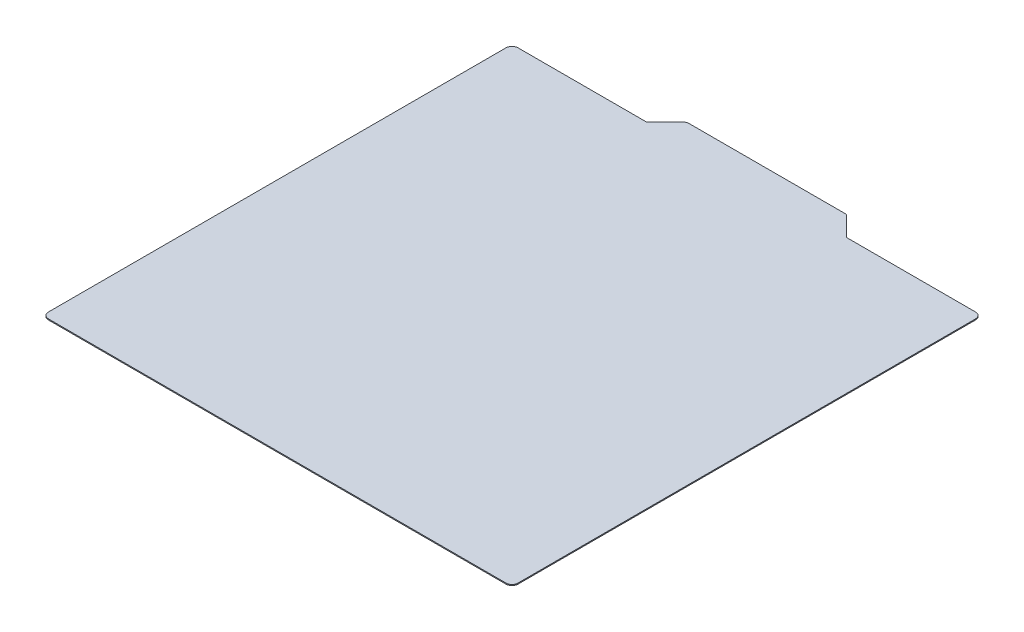
ISO-10303-21;
HEADER;
FILE_DESCRIPTION(('STEP AP214'),'2;1');
FILE_NAME('part.step','',(''),(''),'','','');
FILE_SCHEMA(('AUTOMOTIVE_DESIGN { 1 0 10303 214 1 1 1 1 }'));
ENDSEC;
DATA;
#1=APPLICATION_CONTEXT('core data for automotive mechanical design processes');
#2=APPLICATION_PROTOCOL_DEFINITION('international standard','automotive_design',2000,#1);
#3=PRODUCT_CONTEXT('',#1,'mechanical');
#4=PRODUCT('Part','Part','',(#3));
#5=PRODUCT_RELATED_PRODUCT_CATEGORY('part','',(#4));
#6=PRODUCT_DEFINITION_FORMATION('','',#4);
#7=PRODUCT_DEFINITION_CONTEXT('part definition',#1,'design');
#8=PRODUCT_DEFINITION('design','',#6,#7);
#9=PRODUCT_DEFINITION_SHAPE('','',#8);
#10=(LENGTH_UNIT() NAMED_UNIT(*) SI_UNIT(.MILLI.,.METRE.));
#11=(NAMED_UNIT(*) PLANE_ANGLE_UNIT() SI_UNIT($,.RADIAN.));
#12=(NAMED_UNIT(*) SI_UNIT($,.STERADIAN.) SOLID_ANGLE_UNIT());
#13=UNCERTAINTY_MEASURE_WITH_UNIT(LENGTH_MEASURE(1.E-05),#10,'distance_accuracy_value','');
#14=(GEOMETRIC_REPRESENTATION_CONTEXT(3) GLOBAL_UNCERTAINTY_ASSIGNED_CONTEXT((#13)) GLOBAL_UNIT_ASSIGNED_CONTEXT((#10,
#11,#12)) REPRESENTATION_CONTEXT('',''));
#15=CARTESIAN_POINT('',(0.,0.,0.));
#16=DIRECTION('',(0.,0.,1.));
#17=DIRECTION('',(1.,0.,0.));
#18=AXIS2_PLACEMENT_3D('',#15,#16,#17);
#19=CARTESIAN_POINT('',(-114.5,0.5,-117.5));
#20=DIRECTION('',(0.,0.,1.));
#21=DIRECTION('',(1.,0.,0.));
#22=AXIS2_PLACEMENT_3D('',#19,#20,#21);
#23=PLANE('',#22);
#24=DIRECTION('',(-1.,0.,0.));
#25=VECTOR('',#24,1.);
#26=CARTESIAN_POINT('',(-114.5,0.,-117.5));
#27=LINE('',#26,#25);
#28=CARTESIAN_POINT('',(114.5,0.,-117.5));
#29=VERTEX_POINT('',#28);
#30=CARTESIAN_POINT('',(50.,0.,-117.5));
#31=VERTEX_POINT('',#30);
#32=EDGE_CURVE('E131',#29,#31,#27,.T.);
#33=ORIENTED_EDGE('',*,*,#32,.T.);
#34=DIRECTION('',(0.,1.,0.));
#35=VECTOR('',#34,1.);
#36=CARTESIAN_POINT('',(50.,-100.498756211209,-117.5));
#37=LINE('',#36,#35);
#38=CARTESIAN_POINT('',(50.,0.5,-117.5));
#39=VERTEX_POINT('',#38);
#40=EDGE_CURVE('E140',#31,#39,#37,.T.);
#41=ORIENTED_EDGE('',*,*,#40,.T.);
#42=DIRECTION('',(-1.,0.,0.));
#43=VECTOR('',#42,1.);
#44=CARTESIAN_POINT('',(-114.5,0.5,-117.5));
#45=LINE('',#44,#43);
#46=CARTESIAN_POINT('',(114.5,0.5,-117.5));
#47=VERTEX_POINT('',#46);
#48=EDGE_CURVE('E151',#47,#39,#45,.T.);
#49=ORIENTED_EDGE('',*,*,#48,.F.);
#50=DIRECTION('',(0.,-1.,0.));
#51=VECTOR('',#50,1.);
#52=CARTESIAN_POINT('',(114.5,0.5,-117.5));
#53=LINE('',#52,#51);
#54=EDGE_CURVE('E190',#47,#29,#53,.T.);
#55=ORIENTED_EDGE('',*,*,#54,.T.);
#56=EDGE_LOOP('',(#33,#41,#49,#55));
#57=FACE_BOUND('',#56,.T.);
#58=ADVANCED_FACE('F17',(#57),#23,.F.);
#59=CARTESIAN_POINT('',(114.5,0.5,114.5));
#60=DIRECTION('',(0.,-1.,0.));
#61=DIRECTION('',(0.,0.,-1.));
#62=AXIS2_PLACEMENT_3D('',#59,#60,#61);
#63=CYLINDRICAL_SURFACE('',#62,3.);
#64=CARTESIAN_POINT('',(114.5,0.,114.5));
#65=DIRECTION('',(0.,1.,0.));
#66=DIRECTION('',(0.,0.,-1.));
#67=AXIS2_PLACEMENT_3D('',#64,#65,#66);
#68=CIRCLE('',#67,3.);
#69=CARTESIAN_POINT('',(114.5,0.,117.5));
#70=VERTEX_POINT('',#69);
#71=CARTESIAN_POINT('',(117.5,0.,114.5));
#72=VERTEX_POINT('',#71);
#73=EDGE_CURVE('E137',#70,#72,#68,.T.);
#74=ORIENTED_EDGE('',*,*,#73,.T.);
#75=DIRECTION('',(0.,-1.,0.));
#76=VECTOR('',#75,1.);
#77=CARTESIAN_POINT('',(117.5,0.5,114.5));
#78=LINE('',#77,#76);
#79=CARTESIAN_POINT('',(117.5,0.5,114.5));
#80=VERTEX_POINT('',#79);
#81=EDGE_CURVE('E193',#80,#72,#78,.T.);
#82=ORIENTED_EDGE('',*,*,#81,.F.);
#83=CARTESIAN_POINT('',(114.5,0.5,114.5));
#84=DIRECTION('',(0.,1.,0.));
#85=DIRECTION('',(0.,0.,-1.));
#86=AXIS2_PLACEMENT_3D('',#83,#84,#85);
#87=CIRCLE('',#86,3.);
#88=CARTESIAN_POINT('',(114.5,0.5,117.5));
#89=VERTEX_POINT('',#88);
#90=EDGE_CURVE('E141',#89,#80,#87,.T.);
#91=ORIENTED_EDGE('',*,*,#90,.F.);
#92=DIRECTION('',(0.,-1.,0.));
#93=VECTOR('',#92,1.);
#94=CARTESIAN_POINT('',(114.5,0.5,117.5));
#95=LINE('',#94,#93);
#96=EDGE_CURVE('E165',#89,#70,#95,.T.);
#97=ORIENTED_EDGE('',*,*,#96,.T.);
#98=EDGE_LOOP('',(#74,#82,#91,#97));
#99=FACE_BOUND('',#98,.T.);
#100=ADVANCED_FACE('F243',(#99),#63,.T.);
#101=CARTESIAN_POINT('',(117.5,0.5,-114.5));
#102=DIRECTION('',(-1.,0.,0.));
#103=DIRECTION('',(0.,0.,1.));
#104=AXIS2_PLACEMENT_3D('',#101,#102,#103);
#105=PLANE('',#104);
#106=DIRECTION('',(0.,0.,-1.));
#107=VECTOR('',#106,1.);
#108=CARTESIAN_POINT('',(117.5,0.,-114.5));
#109=LINE('',#108,#107);
#110=CARTESIAN_POINT('',(117.5,0.,-114.5));
#111=VERTEX_POINT('',#110);
#112=EDGE_CURVE('E164',#72,#111,#109,.T.);
#113=ORIENTED_EDGE('',*,*,#112,.T.);
#114=DIRECTION('',(0.,-1.,0.));
#115=VECTOR('',#114,1.);
#116=CARTESIAN_POINT('',(117.5,0.5,-114.5));
#117=LINE('',#116,#115);
#118=CARTESIAN_POINT('',(117.5,0.5,-114.5));
#119=VERTEX_POINT('',#118);
#120=EDGE_CURVE('E189',#119,#111,#117,.T.);
#121=ORIENTED_EDGE('',*,*,#120,.F.);
#122=DIRECTION('',(0.,0.,-1.));
#123=VECTOR('',#122,1.);
#124=CARTESIAN_POINT('',(117.5,0.5,-114.5));
#125=LINE('',#124,#123);
#126=EDGE_CURVE('E148',#80,#119,#125,.T.);
#127=ORIENTED_EDGE('',*,*,#126,.F.);
#128=ORIENTED_EDGE('',*,*,#81,.T.);
#129=EDGE_LOOP('',(#113,#121,#127,#128));
#130=FACE_BOUND('',#129,.T.);
#131=ADVANCED_FACE('F253',(#130),#105,.F.);
#132=CARTESIAN_POINT('',(114.5,0.5,-114.5));
#133=DIRECTION('',(0.,-1.,0.));
#134=DIRECTION('',(0.,0.,-1.));
#135=AXIS2_PLACEMENT_3D('',#132,#133,#134);
#136=CYLINDRICAL_SURFACE('',#135,3.);
#137=CARTESIAN_POINT('',(114.5,0.,-114.5));
#138=DIRECTION('',(0.,1.,0.));
#139=DIRECTION('',(0.,0.,1.));
#140=AXIS2_PLACEMENT_3D('',#137,#138,#139);
#141=CIRCLE('',#140,3.);
#142=EDGE_CURVE('E135',#111,#29,#141,.T.);
#143=ORIENTED_EDGE('',*,*,#142,.T.);
#144=ORIENTED_EDGE('',*,*,#54,.F.);
#145=CARTESIAN_POINT('',(114.5,0.5,-114.5));
#146=DIRECTION('',(0.,1.,0.));
#147=DIRECTION('',(0.,0.,1.));
#148=AXIS2_PLACEMENT_3D('',#145,#146,#147);
#149=CIRCLE('',#148,3.);
#150=EDGE_CURVE('E149',#119,#47,#149,.T.);
#151=ORIENTED_EDGE('',*,*,#150,.F.);
#152=ORIENTED_EDGE('',*,*,#120,.T.);
#153=EDGE_LOOP('',(#143,#144,#151,#152));
#154=FACE_BOUND('',#153,.T.);
#155=ADVANCED_FACE('F256',(#154),#136,.T.);
#156=CARTESIAN_POINT('',(-50.,0.5,-117.5));
#157=VERTEX_POINT('',#156);
#158=CARTESIAN_POINT('',(-114.5,0.5,-117.5));
#159=VERTEX_POINT('',#158);
#160=EDGE_CURVE('E136',#157,#159,#45,.T.);
#161=ORIENTED_EDGE('',*,*,#160,.F.);
#162=DIRECTION('',(0.,1.,0.));
#163=VECTOR('',#162,1.);
#164=CARTESIAN_POINT('',(-50.,-100.498756211209,-117.5));
#165=LINE('',#164,#163);
#166=CARTESIAN_POINT('',(-50.,0.,-117.5));
#167=VERTEX_POINT('',#166);
#168=EDGE_CURVE('E120',#167,#157,#165,.T.);
#169=ORIENTED_EDGE('',*,*,#168,.F.);
#170=CARTESIAN_POINT('',(-114.5,0.,-117.5));
#171=VERTEX_POINT('',#170);
#172=EDGE_CURVE('E121',#167,#171,#27,.T.);
#173=ORIENTED_EDGE('',*,*,#172,.T.);
#174=DIRECTION('',(0.,-1.,0.));
#175=VECTOR('',#174,1.);
#176=CARTESIAN_POINT('',(-114.5,0.5,-117.5));
#177=LINE('',#176,#175);
#178=EDGE_CURVE('E184',#159,#171,#177,.T.);
#179=ORIENTED_EDGE('',*,*,#178,.F.);
#180=EDGE_LOOP('',(#161,#169,#173,#179));
#181=FACE_BOUND('',#180,.T.);
#182=ADVANCED_FACE('F134',(#181),#23,.F.);
#183=CARTESIAN_POINT('',(-114.5,0.5,-114.5));
#184=DIRECTION('',(0.,-1.,0.));
#185=DIRECTION('',(0.,0.,-1.));
#186=AXIS2_PLACEMENT_3D('',#183,#184,#185);
#187=CYLINDRICAL_SURFACE('',#186,3.);
#188=CARTESIAN_POINT('',(-114.5,0.,-114.5));
#189=DIRECTION('',(0.,1.,0.));
#190=DIRECTION('',(0.,0.,1.));
#191=AXIS2_PLACEMENT_3D('',#188,#189,#190);
#192=CIRCLE('',#191,3.);
#193=CARTESIAN_POINT('',(-117.5,0.,-114.5));
#194=VERTEX_POINT('',#193);
#195=EDGE_CURVE('E126',#171,#194,#192,.T.);
#196=ORIENTED_EDGE('',*,*,#195,.T.);
#197=DIRECTION('',(0.,-1.,0.));
#198=VECTOR('',#197,1.);
#199=CARTESIAN_POINT('',(-117.5,0.5,-114.5));
#200=LINE('',#199,#198);
#201=CARTESIAN_POINT('',(-117.5,0.5,-114.5));
#202=VERTEX_POINT('',#201);
#203=EDGE_CURVE('E181',#202,#194,#200,.T.);
#204=ORIENTED_EDGE('',*,*,#203,.F.);
#205=CARTESIAN_POINT('',(-114.5,0.5,-114.5));
#206=DIRECTION('',(0.,1.,0.));
#207=DIRECTION('',(0.,0.,1.));
#208=AXIS2_PLACEMENT_3D('',#205,#206,#207);
#209=CIRCLE('',#208,3.);
#210=EDGE_CURVE('E152',#159,#202,#209,.T.);
#211=ORIENTED_EDGE('',*,*,#210,.F.);
#212=ORIENTED_EDGE('',*,*,#178,.T.);
#213=EDGE_LOOP('',(#196,#204,#211,#212));
#214=FACE_BOUND('',#213,.T.);
#215=ADVANCED_FACE('F260',(#214),#187,.T.);
#216=CARTESIAN_POINT('',(-117.5,0.5,-114.5));
#217=DIRECTION('',(1.,0.,0.));
#218=DIRECTION('',(0.,0.,-1.));
#219=AXIS2_PLACEMENT_3D('',#216,#217,#218);
#220=PLANE('',#219);
#221=DIRECTION('',(0.,0.,1.));
#222=VECTOR('',#221,1.);
#223=CARTESIAN_POINT('',(-117.5,0.,-114.5));
#224=LINE('',#223,#222);
#225=CARTESIAN_POINT('',(-117.5,0.,114.5));
#226=VERTEX_POINT('',#225);
#227=EDGE_CURVE('E166',#194,#226,#224,.T.);
#228=ORIENTED_EDGE('',*,*,#227,.T.);
#229=DIRECTION('',(0.,-1.,0.));
#230=VECTOR('',#229,1.);
#231=CARTESIAN_POINT('',(-117.5,0.5,114.5));
#232=LINE('',#231,#230);
#233=CARTESIAN_POINT('',(-117.5,0.5,114.5));
#234=VERTEX_POINT('',#233);
#235=EDGE_CURVE('E176',#234,#226,#232,.T.);
#236=ORIENTED_EDGE('',*,*,#235,.F.);
#237=DIRECTION('',(0.,0.,1.));
#238=VECTOR('',#237,1.);
#239=CARTESIAN_POINT('',(-117.5,0.5,-114.5));
#240=LINE('',#239,#238);
#241=EDGE_CURVE('E156',#202,#234,#240,.T.);
#242=ORIENTED_EDGE('',*,*,#241,.F.);
#243=ORIENTED_EDGE('',*,*,#203,.T.);
#244=EDGE_LOOP('',(#228,#236,#242,#243));
#245=FACE_BOUND('',#244,.T.);
#246=ADVANCED_FACE('F262',(#245),#220,.F.);
#247=CARTESIAN_POINT('',(-114.5,0.5,114.5));
#248=DIRECTION('',(0.,-1.,0.));
#249=DIRECTION('',(0.,0.,-1.));
#250=AXIS2_PLACEMENT_3D('',#247,#248,#249);
#251=CYLINDRICAL_SURFACE('',#250,3.);
#252=CARTESIAN_POINT('',(-114.5,0.,114.5));
#253=DIRECTION('',(0.,1.,0.));
#254=DIRECTION('',(0.,0.,-1.));
#255=AXIS2_PLACEMENT_3D('',#252,#253,#254);
#256=CIRCLE('',#255,3.);
#257=CARTESIAN_POINT('',(-114.5,0.,117.5));
#258=VERTEX_POINT('',#257);
#259=EDGE_CURVE('E171',#226,#258,#256,.T.);
#260=ORIENTED_EDGE('',*,*,#259,.T.);
#261=DIRECTION('',(0.,-1.,0.));
#262=VECTOR('',#261,1.);
#263=CARTESIAN_POINT('',(-114.5,0.5,117.5));
#264=LINE('',#263,#262);
#265=CARTESIAN_POINT('',(-114.5,0.5,117.5));
#266=VERTEX_POINT('',#265);
#267=EDGE_CURVE('E177',#266,#258,#264,.T.);
#268=ORIENTED_EDGE('',*,*,#267,.F.);
#269=CARTESIAN_POINT('',(-114.5,0.5,114.5));
#270=DIRECTION('',(0.,1.,0.));
#271=DIRECTION('',(0.,0.,-1.));
#272=AXIS2_PLACEMENT_3D('',#269,#270,#271);
#273=CIRCLE('',#272,3.);
#274=EDGE_CURVE('E158',#234,#266,#273,.T.);
#275=ORIENTED_EDGE('',*,*,#274,.F.);
#276=ORIENTED_EDGE('',*,*,#235,.T.);
#277=EDGE_LOOP('',(#260,#268,#275,#276));
#278=FACE_BOUND('',#277,.T.);
#279=ADVANCED_FACE('F288',(#278),#251,.T.);
#280=CARTESIAN_POINT('',(-114.5,0.5,117.5));
#281=DIRECTION('',(0.,0.,-1.));
#282=DIRECTION('',(-1.,0.,0.));
#283=AXIS2_PLACEMENT_3D('',#280,#281,#282);
#284=PLANE('',#283);
#285=DIRECTION('',(1.,0.,0.));
#286=VECTOR('',#285,1.);
#287=CARTESIAN_POINT('',(-114.5,0.,117.5));
#288=LINE('',#287,#286);
#289=EDGE_CURVE('E150',#258,#70,#288,.T.);
#290=ORIENTED_EDGE('',*,*,#289,.T.);
#291=ORIENTED_EDGE('',*,*,#96,.F.);
#292=DIRECTION('',(1.,0.,0.));
#293=VECTOR('',#292,1.);
#294=CARTESIAN_POINT('',(-114.5,0.5,117.5));
#295=LINE('',#294,#293);
#296=EDGE_CURVE('E159',#266,#89,#295,.T.);
#297=ORIENTED_EDGE('',*,*,#296,.F.);
#298=ORIENTED_EDGE('',*,*,#267,.T.);
#299=EDGE_LOOP('',(#290,#291,#297,#298));
#300=FACE_BOUND('',#299,.T.);
#301=ADVANCED_FACE('F287',(#300),#284,.F.);
#302=CARTESIAN_POINT('',(114.5,0.5,114.5));
#303=DIRECTION('',(0.,-1.,0.));
#304=DIRECTION('',(0.,0.,-1.));
#305=AXIS2_PLACEMENT_3D('',#302,#303,#304);
#306=PLANE('',#305);
#307=DIRECTION('',(-0.707106781186552,0.,-0.707106781186544));
#308=VECTOR('',#307,1.);
#309=CARTESIAN_POINT('',(40.,0.5,-127.5));
#310=LINE('',#309,#308);
#311=CARTESIAN_POINT('',(40.5857864376268,0.5,-126.914213562373));
#312=VERTEX_POINT('',#311);
#313=EDGE_CURVE('E228',#39,#312,#310,.T.);
#314=ORIENTED_EDGE('',*,*,#313,.T.);
#315=CARTESIAN_POINT('',(39.1715728752537,0.5,-125.5));
#316=DIRECTION('',(0.,-1.,0.));
#317=DIRECTION('',(0.,0.,-1.));
#318=AXIS2_PLACEMENT_3D('',#315,#316,#317);
#319=CIRCLE('',#318,2.);
#320=CARTESIAN_POINT('',(39.1715728752537,0.5,-127.5));
#321=VERTEX_POINT('',#320);
#322=EDGE_CURVE('E203',#312,#321,#319,.F.);
#323=ORIENTED_EDGE('',*,*,#322,.T.);
#324=DIRECTION('',(-1.,0.,0.));
#325=VECTOR('',#324,1.);
#326=CARTESIAN_POINT('',(-40.,0.5,-127.5));
#327=LINE('',#326,#325);
#328=CARTESIAN_POINT('',(-39.1715728752537,0.5,-127.5));
#329=VERTEX_POINT('',#328);
#330=EDGE_CURVE('E229',#321,#329,#327,.T.);
#331=ORIENTED_EDGE('',*,*,#330,.T.);
#332=CARTESIAN_POINT('',(-39.1715728752537,0.5,-125.5));
#333=DIRECTION('',(0.,-1.,0.));
#334=DIRECTION('',(0.,0.,-1.));
#335=AXIS2_PLACEMENT_3D('',#332,#333,#334);
#336=CIRCLE('',#335,2.);
#337=CARTESIAN_POINT('',(-40.5857864376268,0.5,-126.914213562373));
#338=VERTEX_POINT('',#337);
#339=EDGE_CURVE('E200',#329,#338,#336,.F.);
#340=ORIENTED_EDGE('',*,*,#339,.T.);
#341=DIRECTION('',(-0.707106781186551,0.,0.707106781186544));
#342=VECTOR('',#341,1.);
#343=CARTESIAN_POINT('',(-50.,0.5,-117.5));
#344=LINE('',#343,#342);
#345=EDGE_CURVE('E222',#338,#157,#344,.T.);
#346=ORIENTED_EDGE('',*,*,#345,.T.);
#347=ORIENTED_EDGE('',*,*,#160,.T.);
#348=ORIENTED_EDGE('',*,*,#210,.T.);
#349=ORIENTED_EDGE('',*,*,#241,.T.);
#350=ORIENTED_EDGE('',*,*,#274,.T.);
#351=ORIENTED_EDGE('',*,*,#296,.T.);
#352=ORIENTED_EDGE('',*,*,#90,.T.);
#353=ORIENTED_EDGE('',*,*,#126,.T.);
#354=ORIENTED_EDGE('',*,*,#150,.T.);
#355=ORIENTED_EDGE('',*,*,#48,.T.);
#356=EDGE_LOOP('',(#314,#323,#331,#340,#346,#347,#348,#349,#350,#351,#352,#353,#354,#355));
#357=FACE_BOUND('',#356,.T.);
#358=ADVANCED_FACE('F227',(#357),#306,.F.);
#359=CARTESIAN_POINT('',(114.5,0.,114.5));
#360=DIRECTION('',(0.,-1.,0.));
#361=DIRECTION('',(0.,0.,-1.));
#362=AXIS2_PLACEMENT_3D('',#359,#360,#361);
#363=PLANE('',#362);
#364=DIRECTION('',(-1.,0.,0.));
#365=VECTOR('',#364,1.);
#366=CARTESIAN_POINT('',(-40.,0.,-127.5));
#367=LINE('',#366,#365);
#368=CARTESIAN_POINT('',(39.1715728752537,0.,-127.5));
#369=VERTEX_POINT('',#368);
#370=CARTESIAN_POINT('',(-39.1715728752537,0.,-127.5));
#371=VERTEX_POINT('',#370);
#372=EDGE_CURVE('E122',#369,#371,#367,.T.);
#373=ORIENTED_EDGE('',*,*,#372,.F.);
#374=CARTESIAN_POINT('',(39.1715728752537,0.,-125.5));
#375=DIRECTION('',(0.,-1.,0.));
#376=DIRECTION('',(0.,0.,-1.));
#377=AXIS2_PLACEMENT_3D('',#374,#375,#376);
#378=CIRCLE('',#377,2.);
#379=CARTESIAN_POINT('',(40.5857864376268,0.,-126.914213562373));
#380=VERTEX_POINT('',#379);
#381=EDGE_CURVE('E25',#369,#380,#378,.T.);
#382=ORIENTED_EDGE('',*,*,#381,.T.);
#383=DIRECTION('',(-0.707106781186552,0.,-0.707106781186544));
#384=VECTOR('',#383,1.);
#385=CARTESIAN_POINT('',(40.,0.,-127.5));
#386=LINE('',#385,#384);
#387=EDGE_CURVE('E215',#31,#380,#386,.T.);
#388=ORIENTED_EDGE('',*,*,#387,.F.);
#389=ORIENTED_EDGE('',*,*,#32,.F.);
#390=ORIENTED_EDGE('',*,*,#142,.F.);
#391=ORIENTED_EDGE('',*,*,#112,.F.);
#392=ORIENTED_EDGE('',*,*,#73,.F.);
#393=ORIENTED_EDGE('',*,*,#289,.F.);
#394=ORIENTED_EDGE('',*,*,#259,.F.);
#395=ORIENTED_EDGE('',*,*,#227,.F.);
#396=ORIENTED_EDGE('',*,*,#195,.F.);
#397=ORIENTED_EDGE('',*,*,#172,.F.);
#398=DIRECTION('',(-0.707106781186551,0.,0.707106781186544));
#399=VECTOR('',#398,1.);
#400=CARTESIAN_POINT('',(-50.,0.,-117.5));
#401=LINE('',#400,#399);
#402=CARTESIAN_POINT('',(-40.5857864376268,0.,-126.914213562373));
#403=VERTEX_POINT('',#402);
#404=EDGE_CURVE('E116',#403,#167,#401,.T.);
#405=ORIENTED_EDGE('',*,*,#404,.F.);
#406=CARTESIAN_POINT('',(-39.1715728752537,0.,-125.5));
#407=DIRECTION('',(0.,-1.,0.));
#408=DIRECTION('',(0.,0.,-1.));
#409=AXIS2_PLACEMENT_3D('',#406,#407,#408);
#410=CIRCLE('',#409,2.);
#411=EDGE_CURVE('E40',#403,#371,#410,.T.);
#412=ORIENTED_EDGE('',*,*,#411,.T.);
#413=EDGE_LOOP('',(#373,#382,#388,#389,#390,#391,#392,#393,#394,#395,#396,#397,#405,#412));
#414=FACE_BOUND('',#413,.T.);
#415=ADVANCED_FACE('F123',(#414),#363,.T.);
#416=CARTESIAN_POINT('',(40.,-100.498756211209,-127.5));
#417=DIRECTION('',(0.707106781186544,0.,-0.707106781186552));
#418=DIRECTION('',(-0.707106781186552,0.,-0.707106781186544));
#419=AXIS2_PLACEMENT_3D('',#416,#417,#418);
#420=PLANE('',#419);
#421=ORIENTED_EDGE('',*,*,#387,.T.);
#422=DIRECTION('',(0.,1.,0.));
#423=VECTOR('',#422,1.);
#424=CARTESIAN_POINT('',(40.5857864376268,-100.498756211209,-126.914213562373));
#425=LINE('',#424,#423);
#426=EDGE_CURVE('E198',#380,#312,#425,.T.);
#427=ORIENTED_EDGE('',*,*,#426,.T.);
#428=ORIENTED_EDGE('',*,*,#313,.F.);
#429=ORIENTED_EDGE('',*,*,#40,.F.);
#430=EDGE_LOOP('',(#421,#427,#428,#429));
#431=FACE_BOUND('',#430,.T.);
#432=ADVANCED_FACE('F217',(#431),#420,.T.);
#433=CARTESIAN_POINT('',(-40.,-100.498756211209,-127.5));
#434=DIRECTION('',(0.,0.,-1.));
#435=DIRECTION('',(-1.,0.,0.));
#436=AXIS2_PLACEMENT_3D('',#433,#434,#435);
#437=PLANE('',#436);
#438=ORIENTED_EDGE('',*,*,#330,.F.);
#439=DIRECTION('',(0.,1.,0.));
#440=VECTOR('',#439,1.);
#441=CARTESIAN_POINT('',(39.1715728752537,-100.498756211209,-127.5));
#442=LINE('',#441,#440);
#443=EDGE_CURVE('E206',#321,#369,#442,.F.);
#444=ORIENTED_EDGE('',*,*,#443,.T.);
#445=ORIENTED_EDGE('',*,*,#372,.T.);
#446=DIRECTION('',(0.,1.,0.));
#447=VECTOR('',#446,1.);
#448=CARTESIAN_POINT('',(-39.1715728752537,-100.498756211209,-127.5));
#449=LINE('',#448,#447);
#450=EDGE_CURVE('E201',#371,#329,#449,.T.);
#451=ORIENTED_EDGE('',*,*,#450,.T.);
#452=EDGE_LOOP('',(#438,#444,#445,#451));
#453=FACE_BOUND('',#452,.T.);
#454=ADVANCED_FACE('F232',(#453),#437,.T.);
#455=CARTESIAN_POINT('',(-50.,-100.498756211209,-117.5));
#456=DIRECTION('',(-0.707106781186544,0.,-0.707106781186551));
#457=DIRECTION('',(-0.707106781186551,0.,0.707106781186544));
#458=AXIS2_PLACEMENT_3D('',#455,#456,#457);
#459=PLANE('',#458);
#460=ORIENTED_EDGE('',*,*,#345,.F.);
#461=DIRECTION('',(0.,1.,0.));
#462=VECTOR('',#461,1.);
#463=CARTESIAN_POINT('',(-40.5857864376268,-100.498756211209,-126.914213562373));
#464=LINE('',#463,#462);
#465=EDGE_CURVE('E11',#338,#403,#464,.F.);
#466=ORIENTED_EDGE('',*,*,#465,.T.);
#467=ORIENTED_EDGE('',*,*,#404,.T.);
#468=ORIENTED_EDGE('',*,*,#168,.T.);
#469=EDGE_LOOP('',(#460,#466,#467,#468));
#470=FACE_BOUND('',#469,.T.);
#471=ADVANCED_FACE('F119',(#470),#459,.T.);
#472=CARTESIAN_POINT('',(39.1715728752537,-100.498756211209,-125.5));
#473=DIRECTION('',(0.,1.,0.));
#474=DIRECTION('',(0.,0.,1.));
#475=AXIS2_PLACEMENT_3D('',#472,#473,#474);
#476=CYLINDRICAL_SURFACE('',#475,2.);
#477=ORIENTED_EDGE('',*,*,#381,.F.);
#478=ORIENTED_EDGE('',*,*,#443,.F.);
#479=ORIENTED_EDGE('',*,*,#322,.F.);
#480=ORIENTED_EDGE('',*,*,#426,.F.);
#481=EDGE_LOOP('',(#477,#478,#479,#480));
#482=FACE_BOUND('',#481,.T.);
#483=ADVANCED_FACE('F224',(#482),#476,.T.);
#484=CARTESIAN_POINT('',(-39.1715728752537,-100.498756211209,-125.5));
#485=DIRECTION('',(0.,1.,0.));
#486=DIRECTION('',(0.,0.,1.));
#487=AXIS2_PLACEMENT_3D('',#484,#485,#486);
#488=CYLINDRICAL_SURFACE('',#487,2.);
#489=ORIENTED_EDGE('',*,*,#411,.F.);
#490=ORIENTED_EDGE('',*,*,#465,.F.);
#491=ORIENTED_EDGE('',*,*,#339,.F.);
#492=ORIENTED_EDGE('',*,*,#450,.F.);
#493=EDGE_LOOP('',(#489,#490,#491,#492));
#494=FACE_BOUND('',#493,.T.);
#495=ADVANCED_FACE('F19',(#494),#488,.T.);
#496=CLOSED_SHELL('',(#58,#100,#131,#155,#182,#215,#246,#279,#301,#358,#415,#432,#454,#471,#483,#495));
#497=MANIFOLD_SOLID_BREP('B1',#496);
#498=ADVANCED_BREP_SHAPE_REPRESENTATION('',(#18,#497),#14);
#499=SHAPE_DEFINITION_REPRESENTATION(#9,#498);
ENDSEC;
END-ISO-10303-21;
